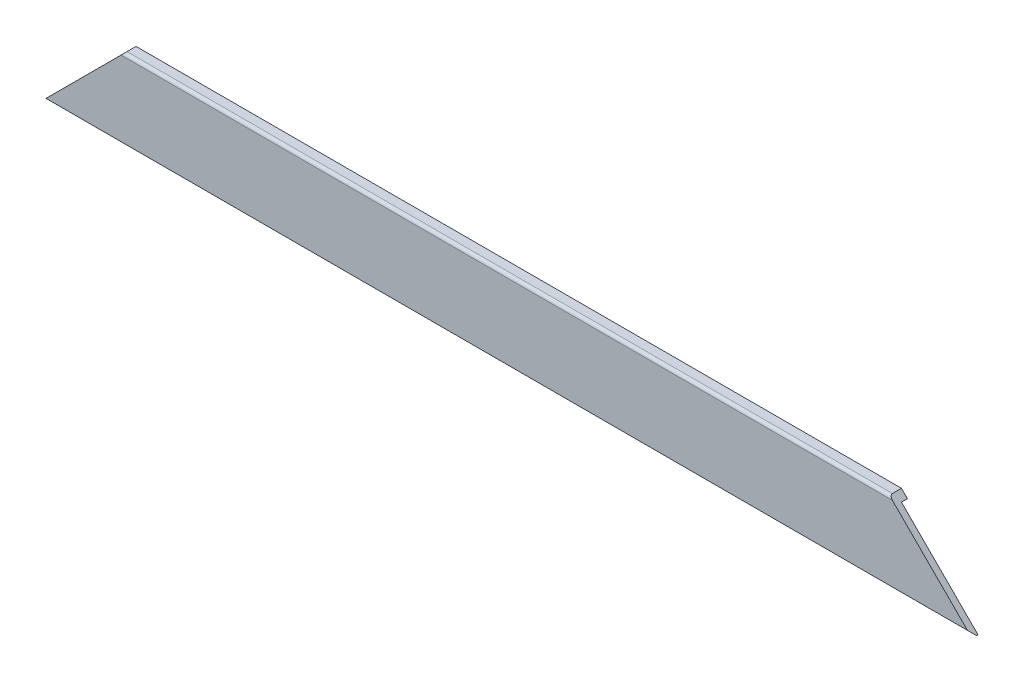
ISO-10303-21;
HEADER;
FILE_DESCRIPTION(('STEP AP214'),'2;1');
FILE_NAME('part.step','',(''),(''),'','','');
FILE_SCHEMA(('AUTOMOTIVE_DESIGN { 1 0 10303 214 1 1 1 1 }'));
ENDSEC;
DATA;
#1=APPLICATION_CONTEXT('core data for automotive mechanical design processes');
#2=APPLICATION_PROTOCOL_DEFINITION('international standard','automotive_design',2000,#1);
#3=PRODUCT_CONTEXT('',#1,'mechanical');
#4=PRODUCT('Part','Part','',(#3));
#5=PRODUCT_RELATED_PRODUCT_CATEGORY('part','',(#4));
#6=PRODUCT_DEFINITION_FORMATION('','',#4);
#7=PRODUCT_DEFINITION_CONTEXT('part definition',#1,'design');
#8=PRODUCT_DEFINITION('design','',#6,#7);
#9=PRODUCT_DEFINITION_SHAPE('','',#8);
#10=(LENGTH_UNIT() NAMED_UNIT(*) SI_UNIT(.MILLI.,.METRE.));
#11=(NAMED_UNIT(*) PLANE_ANGLE_UNIT() SI_UNIT($,.RADIAN.));
#12=(NAMED_UNIT(*) SI_UNIT($,.STERADIAN.) SOLID_ANGLE_UNIT());
#13=UNCERTAINTY_MEASURE_WITH_UNIT(LENGTH_MEASURE(1.E-05),#10,'distance_accuracy_value','');
#14=(GEOMETRIC_REPRESENTATION_CONTEXT(3) GLOBAL_UNCERTAINTY_ASSIGNED_CONTEXT((#13)) GLOBAL_UNIT_ASSIGNED_CONTEXT((#10,
#11,#12)) REPRESENTATION_CONTEXT('',''));
#15=CARTESIAN_POINT('',(0.,0.,0.));
#16=DIRECTION('',(0.,0.,1.));
#17=DIRECTION('',(1.,0.,0.));
#18=AXIS2_PLACEMENT_3D('',#15,#16,#17);
#19=CARTESIAN_POINT('',(0.,0.,2.));
#20=DIRECTION('',(0.,1.,0.));
#21=DIRECTION('',(0.,0.,1.));
#22=AXIS2_PLACEMENT_3D('',#19,#20,#21);
#23=PLANE('',#22);
#24=DIRECTION('',(0.,0.,-1.));
#25=VECTOR('',#24,1.);
#26=CARTESIAN_POINT('',(310.,0.,2.));
#27=LINE('',#26,#25);
#28=CARTESIAN_POINT('',(310.,0.,0.499999999999978));
#29=VERTEX_POINT('',#28);
#30=CARTESIAN_POINT('',(310.,0.,0.));
#31=VERTEX_POINT('',#30);
#32=EDGE_CURVE('E122',#29,#31,#27,.T.);
#33=ORIENTED_EDGE('',*,*,#32,.F.);
#34=DIRECTION('',(-1.,0.,0.));
#35=VECTOR('',#34,1.);
#36=CARTESIAN_POINT('',(0.,0.,0.499999999999971));
#37=LINE('',#36,#35);
#38=CARTESIAN_POINT('',(0.,0.,0.499999999999968));
#39=VERTEX_POINT('',#38);
#40=EDGE_CURVE('E113',#29,#39,#37,.T.);
#41=ORIENTED_EDGE('',*,*,#40,.T.);
#42=DIRECTION('',(0.,0.,-1.));
#43=VECTOR('',#42,1.);
#44=CARTESIAN_POINT('',(0.,0.,2.));
#45=LINE('',#44,#43);
#46=CARTESIAN_POINT('',(0.,0.,0.));
#47=VERTEX_POINT('',#46);
#48=EDGE_CURVE('E119',#39,#47,#45,.T.);
#49=ORIENTED_EDGE('',*,*,#48,.T.);
#50=DIRECTION('',(1.,0.,0.));
#51=VECTOR('',#50,1.);
#52=CARTESIAN_POINT('',(0.,0.,0.));
#53=LINE('',#52,#51);
#54=EDGE_CURVE('E125',#47,#31,#53,.T.);
#55=ORIENTED_EDGE('',*,*,#54,.T.);
#56=EDGE_LOOP('',(#33,#41,#49,#55));
#57=FACE_BOUND('',#56,.T.);
#58=ADVANCED_FACE('F33',(#57),#23,.F.);
#59=CARTESIAN_POINT('',(0.,0.,2.));
#60=DIRECTION('',(0.,0.,-1.));
#61=DIRECTION('',(-1.,0.,0.));
#62=AXIS2_PLACEMENT_3D('',#59,#60,#61);
#63=PLANE('',#62);
#64=DIRECTION('',(1.,0.,0.));
#65=VECTOR('',#64,1.);
#66=CARTESIAN_POINT('',(0.,1.5,2.));
#67=LINE('',#66,#65);
#68=CARTESIAN_POINT('',(1.50000000000001,1.5,2.));
#69=VERTEX_POINT('',#68);
#70=CARTESIAN_POINT('',(308.5,1.49999999999999,2.));
#71=VERTEX_POINT('',#70);
#72=EDGE_CURVE('E107',#69,#71,#67,.T.);
#73=ORIENTED_EDGE('',*,*,#72,.T.);
#74=DIRECTION('',(0.707106781186551,-0.707106781186543,0.));
#75=VECTOR('',#74,1.);
#76=CARTESIAN_POINT('',(310.,0.,2.));
#77=LINE('',#76,#75);
#78=CARTESIAN_POINT('',(283.5,26.5,2.));
#79=VERTEX_POINT('',#78);
#80=EDGE_CURVE('E99',#79,#71,#77,.T.);
#81=ORIENTED_EDGE('',*,*,#80,.F.);
#82=DIRECTION('',(1.,0.,0.));
#83=VECTOR('',#82,1.);
#84=CARTESIAN_POINT('',(0.,26.5,2.));
#85=LINE('',#84,#83);
#86=CARTESIAN_POINT('',(26.4999999999999,26.5,2.));
#87=VERTEX_POINT('',#86);
#88=EDGE_CURVE('E57',#79,#87,#85,.F.);
#89=ORIENTED_EDGE('',*,*,#88,.T.);
#90=DIRECTION('',(0.707106781186546,0.707106781186549,0.));
#91=VECTOR('',#90,1.);
#92=CARTESIAN_POINT('',(26.4999999999999,26.5,2.));
#93=LINE('',#92,#91);
#94=EDGE_CURVE('E145',#69,#87,#93,.T.);
#95=ORIENTED_EDGE('',*,*,#94,.F.);
#96=EDGE_LOOP('',(#73,#81,#89,#95));
#97=FACE_BOUND('',#96,.T.);
#98=ADVANCED_FACE('F105',(#97),#63,.F.);
#99=CARTESIAN_POINT('',(0.,0.,0.));
#100=DIRECTION('',(0.,0.,-1.));
#101=DIRECTION('',(-1.,0.,0.));
#102=AXIS2_PLACEMENT_3D('',#99,#100,#101);
#103=PLANE('',#102);
#104=DIRECTION('',(-0.707106781186551,0.707106781186544,0.));
#105=VECTOR('',#104,1.);
#106=CARTESIAN_POINT('',(154.999999999998,155.,0.));
#107=LINE('',#106,#105);
#108=CARTESIAN_POINT('',(284.5,25.5,0.));
#109=VERTEX_POINT('',#108);
#110=EDGE_CURVE('E149',#31,#109,#107,.T.);
#111=ORIENTED_EDGE('',*,*,#110,.F.);
#112=ORIENTED_EDGE('',*,*,#54,.F.);
#113=DIRECTION('',(-0.707106781186546,-0.707106781186549,0.));
#114=VECTOR('',#113,1.);
#115=CARTESIAN_POINT('',(0.,0.,0.));
#116=LINE('',#115,#114);
#117=CARTESIAN_POINT('',(25.4999999999999,25.5,0.));
#118=VERTEX_POINT('',#117);
#119=EDGE_CURVE('E134',#118,#47,#116,.T.);
#120=ORIENTED_EDGE('',*,*,#119,.F.);
#121=DIRECTION('',(-1.,0.,0.));
#122=VECTOR('',#121,1.);
#123=CARTESIAN_POINT('',(0.,25.5,0.));
#124=LINE('',#123,#122);
#125=EDGE_CURVE('E37',#109,#118,#124,.T.);
#126=ORIENTED_EDGE('',*,*,#125,.F.);
#127=EDGE_LOOP('',(#111,#112,#120,#126));
#128=FACE_BOUND('',#127,.T.);
#129=ADVANCED_FACE('F174',(#128),#103,.T.);
#130=CARTESIAN_POINT('',(0.,27.5,-2.));
#131=DIRECTION('',(0.,0.,1.));
#132=DIRECTION('',(1.,0.,0.));
#133=AXIS2_PLACEMENT_3D('',#130,#131,#132);
#134=PLANE('',#133);
#135=DIRECTION('',(-1.,0.,0.));
#136=VECTOR('',#135,1.);
#137=CARTESIAN_POINT('',(0.,27.5,-2.));
#138=LINE('',#137,#136);
#139=CARTESIAN_POINT('',(282.5,27.5,-2.));
#140=VERTEX_POINT('',#139);
#141=CARTESIAN_POINT('',(27.4999999999999,27.5,-2.));
#142=VERTEX_POINT('',#141);
#143=EDGE_CURVE('E128',#140,#142,#138,.T.);
#144=ORIENTED_EDGE('',*,*,#143,.F.);
#145=DIRECTION('',(0.707106781186551,-0.707106781186544,0.));
#146=VECTOR('',#145,1.);
#147=CARTESIAN_POINT('',(141.249999999998,168.75,-2.));
#148=LINE('',#147,#146);
#149=CARTESIAN_POINT('',(284.5,25.5,-2.));
#150=VERTEX_POINT('',#149);
#151=EDGE_CURVE('E153',#140,#150,#148,.T.);
#152=ORIENTED_EDGE('',*,*,#151,.T.);
#153=DIRECTION('',(-1.,0.,0.));
#154=VECTOR('',#153,1.);
#155=CARTESIAN_POINT('',(0.,25.5,-2.));
#156=LINE('',#155,#154);
#157=CARTESIAN_POINT('',(25.4999999999999,25.5,-2.));
#158=VERTEX_POINT('',#157);
#159=EDGE_CURVE('E129',#150,#158,#156,.T.);
#160=ORIENTED_EDGE('',*,*,#159,.T.);
#161=DIRECTION('',(0.707106781186546,0.707106781186549,0.));
#162=VECTOR('',#161,1.);
#163=CARTESIAN_POINT('',(13.75,13.75,-2.));
#164=LINE('',#163,#162);
#165=EDGE_CURVE('E139',#158,#142,#164,.T.);
#166=ORIENTED_EDGE('',*,*,#165,.T.);
#167=EDGE_LOOP('',(#144,#152,#160,#166));
#168=FACE_BOUND('',#167,.T.);
#169=ADVANCED_FACE('F161',(#168),#134,.F.);
#170=CARTESIAN_POINT('',(0.,27.5,0.));
#171=DIRECTION('',(0.,-1.,0.));
#172=DIRECTION('',(0.,0.,-1.));
#173=AXIS2_PLACEMENT_3D('',#170,#171,#172);
#174=PLANE('',#173);
#175=DIRECTION('',(1.,0.,0.));
#176=VECTOR('',#175,1.);
#177=CARTESIAN_POINT('',(0.,27.5,1.));
#178=LINE('',#177,#176);
#179=CARTESIAN_POINT('',(27.4999999999999,27.5,1.));
#180=VERTEX_POINT('',#179);
#181=CARTESIAN_POINT('',(282.5,27.5,1.));
#182=VERTEX_POINT('',#181);
#183=EDGE_CURVE('E110',#180,#182,#178,.T.);
#184=ORIENTED_EDGE('',*,*,#183,.T.);
#185=DIRECTION('',(0.,0.,-1.));
#186=VECTOR('',#185,1.);
#187=CARTESIAN_POINT('',(282.5,27.5,0.));
#188=LINE('',#187,#186);
#189=EDGE_CURVE('E49',#182,#140,#188,.T.);
#190=ORIENTED_EDGE('',*,*,#189,.T.);
#191=ORIENTED_EDGE('',*,*,#143,.T.);
#192=DIRECTION('',(0.,0.,1.));
#193=VECTOR('',#192,1.);
#194=CARTESIAN_POINT('',(27.4999999999999,27.5,0.));
#195=LINE('',#194,#193);
#196=EDGE_CURVE('E142',#142,#180,#195,.T.);
#197=ORIENTED_EDGE('',*,*,#196,.T.);
#198=EDGE_LOOP('',(#184,#190,#191,#197));
#199=FACE_BOUND('',#198,.T.);
#200=ADVANCED_FACE('F158',(#199),#174,.F.);
#201=CARTESIAN_POINT('',(0.,25.5,0.));
#202=DIRECTION('',(0.,-1.,0.));
#203=DIRECTION('',(0.,0.,-1.));
#204=AXIS2_PLACEMENT_3D('',#201,#202,#203);
#205=PLANE('',#204);
#206=DIRECTION('',(0.,0.,-1.));
#207=VECTOR('',#206,1.);
#208=CARTESIAN_POINT('',(284.5,25.5,0.));
#209=LINE('',#208,#207);
#210=EDGE_CURVE('E151',#109,#150,#209,.T.);
#211=ORIENTED_EDGE('',*,*,#210,.F.);
#212=ORIENTED_EDGE('',*,*,#125,.T.);
#213=DIRECTION('',(0.,0.,1.));
#214=VECTOR('',#213,1.);
#215=CARTESIAN_POINT('',(25.4999999999999,25.5,0.));
#216=LINE('',#215,#214);
#217=EDGE_CURVE('E136',#158,#118,#216,.T.);
#218=ORIENTED_EDGE('',*,*,#217,.F.);
#219=ORIENTED_EDGE('',*,*,#159,.F.);
#220=EDGE_LOOP('',(#211,#212,#218,#219));
#221=FACE_BOUND('',#220,.T.);
#222=ADVANCED_FACE('F170',(#221),#205,.T.);
#223=CARTESIAN_POINT('',(0.,1.5,2.));
#224=DIRECTION('',(0.,0.707106781186554,-0.707106781186541));
#225=DIRECTION('',(1.,0.,0.));
#226=AXIS2_PLACEMENT_3D('',#223,#224,#225);
#227=PLANE('',#226);
#228=DIRECTION('',(-0.577350269189627,0.57735026918962,0.577350269189631));
#229=VECTOR('',#228,1.);
#230=CARTESIAN_POINT('',(205.666666666666,104.333333333332,104.833333333334));
#231=LINE('',#230,#229);
#232=EDGE_CURVE('E147',#71,#29,#231,.F.);
#233=ORIENTED_EDGE('',*,*,#232,.F.);
#234=ORIENTED_EDGE('',*,*,#72,.F.);
#235=DIRECTION('',(-0.577350269189621,-0.577350269189623,-0.577350269189634));
#236=VECTOR('',#235,1.);
#237=CARTESIAN_POINT('',(1.00000000000001,1.00000000000001,1.5));
#238=LINE('',#237,#236);
#239=EDGE_CURVE('E131',#39,#69,#238,.F.);
#240=ORIENTED_EDGE('',*,*,#239,.F.);
#241=ORIENTED_EDGE('',*,*,#40,.F.);
#242=EDGE_LOOP('',(#233,#234,#240,#241));
#243=FACE_BOUND('',#242,.T.);
#244=ADVANCED_FACE('F181',(#243),#227,.F.);
#245=CARTESIAN_POINT('',(0.,26.5,1.));
#246=DIRECTION('',(1.,0.,0.));
#247=DIRECTION('',(0.,0.,-1.));
#248=AXIS2_PLACEMENT_3D('',#245,#246,#247);
#249=CYLINDRICAL_SURFACE('',#248,1.);
#250=CARTESIAN_POINT('',(283.5,26.5,1.));
#251=DIRECTION('',(-0.707106781186544,-0.707106781186551,0.));
#252=DIRECTION('',(0.707106781186551,-0.707106781186544,0.));
#253=AXIS2_PLACEMENT_3D('',#250,#251,#252);
#254=ELLIPSE('',#253,1.4142135623731,1.);
#255=EDGE_CURVE('E11',#182,#79,#254,.F.);
#256=ORIENTED_EDGE('',*,*,#255,.F.);
#257=ORIENTED_EDGE('',*,*,#183,.F.);
#258=CARTESIAN_POINT('',(26.4999999999999,26.5,1.));
#259=DIRECTION('',(0.707106781186549,-0.707106781186546,0.));
#260=DIRECTION('',(0.707106781186546,0.707106781186549,0.));
#261=AXIS2_PLACEMENT_3D('',#258,#259,#260);
#262=ELLIPSE('',#261,1.41421356237309,1.);
#263=EDGE_CURVE('E43',#87,#180,#262,.F.);
#264=ORIENTED_EDGE('',*,*,#263,.F.);
#265=ORIENTED_EDGE('',*,*,#88,.F.);
#266=EDGE_LOOP('',(#256,#257,#264,#265));
#267=FACE_BOUND('',#266,.T.);
#268=ADVANCED_FACE('F35',(#267),#249,.T.);
#269=CARTESIAN_POINT('',(26.4999999999999,26.5,-2.000025));
#270=DIRECTION('',(0.707106781186549,-0.707106781186546,0.));
#271=DIRECTION('',(0.707106781186546,0.707106781186549,0.));
#272=AXIS2_PLACEMENT_3D('',#269,#270,#271);
#273=PLANE('',#272);
#274=ORIENTED_EDGE('',*,*,#239,.T.);
#275=ORIENTED_EDGE('',*,*,#94,.T.);
#276=ORIENTED_EDGE('',*,*,#263,.T.);
#277=ORIENTED_EDGE('',*,*,#196,.F.);
#278=ORIENTED_EDGE('',*,*,#165,.F.);
#279=ORIENTED_EDGE('',*,*,#217,.T.);
#280=ORIENTED_EDGE('',*,*,#119,.T.);
#281=ORIENTED_EDGE('',*,*,#48,.F.);
#282=EDGE_LOOP('',(#274,#275,#276,#277,#278,#279,#280,#281));
#283=FACE_BOUND('',#282,.T.);
#284=ADVANCED_FACE('F166',(#283),#273,.F.);
#285=CARTESIAN_POINT('',(310.,0.,-2.000025));
#286=DIRECTION('',(-0.707106781186544,-0.707106781186551,0.));
#287=DIRECTION('',(0.707106781186551,-0.707106781186544,0.));
#288=AXIS2_PLACEMENT_3D('',#285,#286,#287);
#289=PLANE('',#288);
#290=ORIENTED_EDGE('',*,*,#232,.T.);
#291=ORIENTED_EDGE('',*,*,#32,.T.);
#292=ORIENTED_EDGE('',*,*,#110,.T.);
#293=ORIENTED_EDGE('',*,*,#210,.T.);
#294=ORIENTED_EDGE('',*,*,#151,.F.);
#295=ORIENTED_EDGE('',*,*,#189,.F.);
#296=ORIENTED_EDGE('',*,*,#255,.T.);
#297=ORIENTED_EDGE('',*,*,#80,.T.);
#298=EDGE_LOOP('',(#290,#291,#292,#293,#294,#295,#296,#297));
#299=FACE_BOUND('',#298,.T.);
#300=ADVANCED_FACE('F98',(#299),#289,.F.);
#301=CLOSED_SHELL('',(#58,#98,#129,#169,#200,#222,#244,#268,#284,#300));
#302=MANIFOLD_SOLID_BREP('B2',#301);
#303=ADVANCED_BREP_SHAPE_REPRESENTATION('',(#18,#302),#14);
#304=SHAPE_DEFINITION_REPRESENTATION(#9,#303);
ENDSEC;
END-ISO-10303-21;
